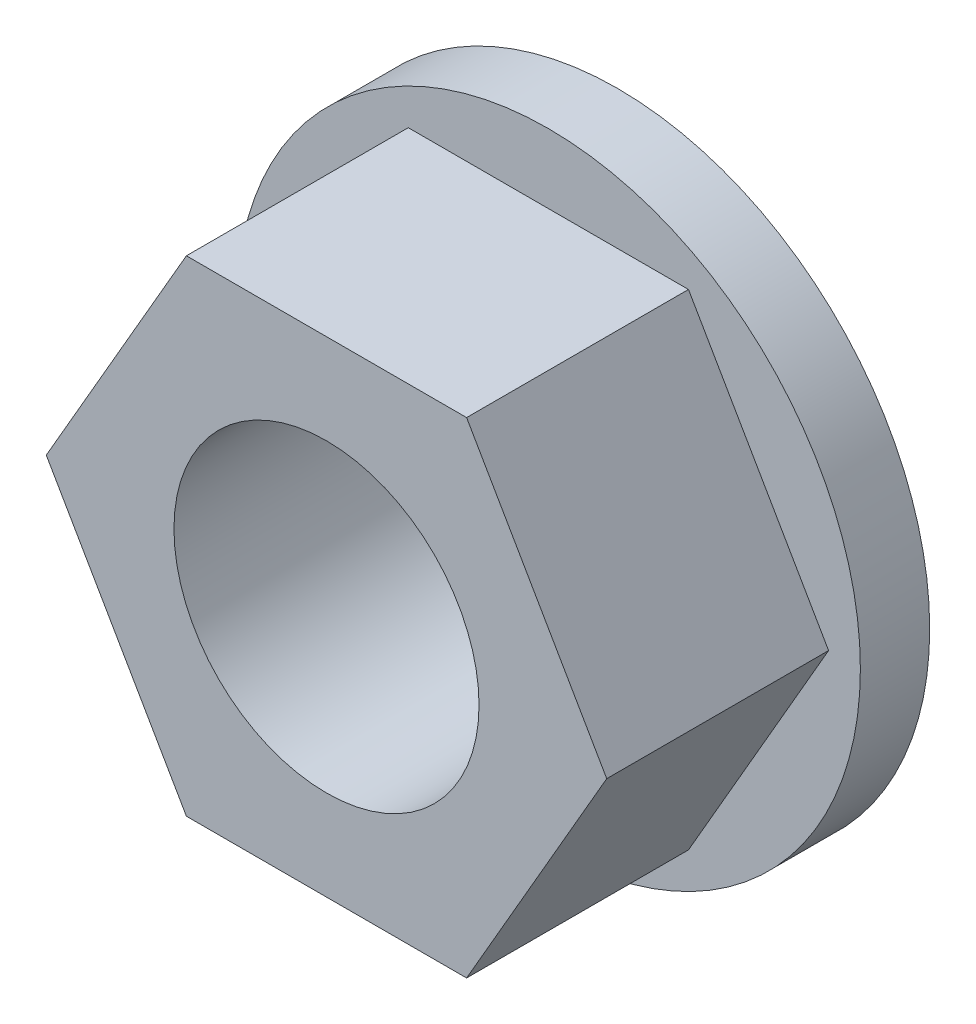
ISO-10303-21;
HEADER;
FILE_DESCRIPTION(('STEP AP214'),'2;1');
FILE_NAME('part.step','',(''),(''),'','','');
FILE_SCHEMA(('AUTOMOTIVE_DESIGN { 1 0 10303 214 1 1 1 1 }'));
ENDSEC;
DATA;
#1=APPLICATION_CONTEXT('core data for automotive mechanical design processes');
#2=APPLICATION_PROTOCOL_DEFINITION('international standard','automotive_design',2000,#1);
#3=PRODUCT_CONTEXT('',#1,'mechanical');
#4=PRODUCT('Part','Part','',(#3));
#5=PRODUCT_RELATED_PRODUCT_CATEGORY('part','',(#4));
#6=PRODUCT_DEFINITION_FORMATION('','',#4);
#7=PRODUCT_DEFINITION_CONTEXT('part definition',#1,'design');
#8=PRODUCT_DEFINITION('design','',#6,#7);
#9=PRODUCT_DEFINITION_SHAPE('','',#8);
#10=(LENGTH_UNIT() NAMED_UNIT(*) SI_UNIT(.MILLI.,.METRE.));
#11=(NAMED_UNIT(*) PLANE_ANGLE_UNIT() SI_UNIT($,.RADIAN.));
#12=(NAMED_UNIT(*) SI_UNIT($,.STERADIAN.) SOLID_ANGLE_UNIT());
#13=UNCERTAINTY_MEASURE_WITH_UNIT(LENGTH_MEASURE(1.E-05),#10,'distance_accuracy_value','');
#14=(GEOMETRIC_REPRESENTATION_CONTEXT(3) GLOBAL_UNCERTAINTY_ASSIGNED_CONTEXT((#13)) GLOBAL_UNIT_ASSIGNED_CONTEXT((#10,
#11,#12)) REPRESENTATION_CONTEXT('',''));
#15=CARTESIAN_POINT('',(0.,0.,0.));
#16=DIRECTION('',(0.,0.,1.));
#17=DIRECTION('',(1.,0.,0.));
#18=AXIS2_PLACEMENT_3D('',#15,#16,#17);
#19=CARTESIAN_POINT('',(0.,0.,4.2));
#20=DIRECTION('',(0.,0.,1.));
#21=DIRECTION('',(1.,0.,0.));
#22=AXIS2_PLACEMENT_3D('',#19,#20,#21);
#23=PLANE('',#22);
#24=CARTESIAN_POINT('',(0.,0.,4.2));
#25=DIRECTION('',(0.,0.,1.));
#26=DIRECTION('',(1.,0.,0.));
#27=AXIS2_PLACEMENT_3D('',#24,#25,#26);
#28=CIRCLE('',#27,2.2);
#29=CARTESIAN_POINT('',(2.2,0.,4.2));
#30=VERTEX_POINT('',#29);
#31=EDGE_CURVE('E9',#30,#30,#28,.T.);
#32=ORIENTED_EDGE('',*,*,#31,.F.);
#33=EDGE_LOOP('',(#32));
#34=FACE_BOUND('',#33,.T.);
#35=DIRECTION('',(-0.50000000000019,0.866025403784329,0.));
#36=VECTOR('',#35,1.);
#37=CARTESIAN_POINT('',(4.041451884327,0.,4.2));
#38=LINE('',#37,#36);
#39=CARTESIAN_POINT('',(4.041451884327,0.,4.2));
#40=VERTEX_POINT('',#39);
#41=CARTESIAN_POINT('',(2.020725942164,3.5,4.2));
#42=VERTEX_POINT('',#41);
#43=EDGE_CURVE('E92',#40,#42,#38,.T.);
#44=ORIENTED_EDGE('',*,*,#43,.T.);
#45=DIRECTION('',(-1.,0.,0.));
#46=VECTOR('',#45,1.);
#47=CARTESIAN_POINT('',(2.020725942164,3.5,4.2));
#48=LINE('',#47,#46);
#49=CARTESIAN_POINT('',(-2.020725942164,3.5,4.2));
#50=VERTEX_POINT('',#49);
#51=EDGE_CURVE('E147',#42,#50,#48,.T.);
#52=ORIENTED_EDGE('',*,*,#51,.T.);
#53=DIRECTION('',(-0.50000000000019,-0.866025403784329,0.));
#54=VECTOR('',#53,1.);
#55=CARTESIAN_POINT('',(-2.020725942164,3.5,4.2));
#56=LINE('',#55,#54);
#57=CARTESIAN_POINT('',(-4.041451884327,0.,4.2));
#58=VERTEX_POINT('',#57);
#59=EDGE_CURVE('E138',#50,#58,#56,.T.);
#60=ORIENTED_EDGE('',*,*,#59,.T.);
#61=DIRECTION('',(0.50000000000019,-0.866025403784329,0.));
#62=VECTOR('',#61,1.);
#63=CARTESIAN_POINT('',(-4.041451884327,0.,4.2));
#64=LINE('',#63,#62);
#65=CARTESIAN_POINT('',(-2.020725942164,-3.5,4.2));
#66=VERTEX_POINT('',#65);
#67=EDGE_CURVE('E137',#58,#66,#64,.T.);
#68=ORIENTED_EDGE('',*,*,#67,.T.);
#69=DIRECTION('',(1.,0.,0.));
#70=VECTOR('',#69,1.);
#71=CARTESIAN_POINT('',(-2.020725942164,-3.5,4.2));
#72=LINE('',#71,#70);
#73=CARTESIAN_POINT('',(2.020725942164,-3.5,4.2));
#74=VERTEX_POINT('',#73);
#75=EDGE_CURVE('E43',#66,#74,#72,.T.);
#76=ORIENTED_EDGE('',*,*,#75,.T.);
#77=DIRECTION('',(0.50000000000019,0.866025403784329,0.));
#78=VECTOR('',#77,1.);
#79=CARTESIAN_POINT('',(2.020725942164,-3.5,4.2));
#80=LINE('',#79,#78);
#81=EDGE_CURVE('E23',#74,#40,#80,.T.);
#82=ORIENTED_EDGE('',*,*,#81,.T.);
#83=EDGE_LOOP('',(#44,#52,#60,#68,#76,#82));
#84=FACE_BOUND('',#83,.T.);
#85=ADVANCED_FACE('F15',(#34,#84),#23,.T.);
#86=CARTESIAN_POINT('',(0.,0.,-1.));
#87=DIRECTION('',(0.,0.,1.));
#88=DIRECTION('',(1.,0.,0.));
#89=AXIS2_PLACEMENT_3D('',#86,#87,#88);
#90=CYLINDRICAL_SURFACE('',#89,2.2);
#91=ORIENTED_EDGE('',*,*,#31,.T.);
#92=EDGE_LOOP('',(#91));
#93=FACE_BOUND('',#92,.T.);
#94=CARTESIAN_POINT('',(0.,0.,0.));
#95=DIRECTION('',(0.,0.,1.));
#96=DIRECTION('',(1.,0.,0.));
#97=AXIS2_PLACEMENT_3D('',#94,#95,#96);
#98=CIRCLE('',#97,2.2);
#99=CARTESIAN_POINT('',(2.2,0.,0.));
#100=VERTEX_POINT('',#99);
#101=EDGE_CURVE('E132',#100,#100,#98,.T.);
#102=ORIENTED_EDGE('',*,*,#101,.F.);
#103=EDGE_LOOP('',(#102));
#104=FACE_BOUND('',#103,.T.);
#105=ADVANCED_FACE('F184',(#93,#104),#90,.F.);
#106=CARTESIAN_POINT('',(2.020725942164,-3.5,1.));
#107=DIRECTION('',(-0.866025403784329,0.50000000000019,0.));
#108=DIRECTION('',(0.,0.,1.));
#109=AXIS2_PLACEMENT_3D('',#106,#107,#108);
#110=PLANE('',#109);
#111=DIRECTION('',(0.50000000000019,0.866025403784329,0.));
#112=VECTOR('',#111,1.);
#113=CARTESIAN_POINT('',(2.020725942164,-3.5,1.));
#114=LINE('',#113,#112);
#115=CARTESIAN_POINT('',(2.020725942164,-3.5,1.));
#116=VERTEX_POINT('',#115);
#117=CARTESIAN_POINT('',(4.041451884327,0.,1.));
#118=VERTEX_POINT('',#117);
#119=EDGE_CURVE('E97',#116,#118,#114,.T.);
#120=ORIENTED_EDGE('',*,*,#119,.T.);
#121=DIRECTION('',(0.,0.,1.));
#122=VECTOR('',#121,1.);
#123=CARTESIAN_POINT('',(4.041451884327,0.,1.));
#124=LINE('',#123,#122);
#125=EDGE_CURVE('E85',#118,#40,#124,.T.);
#126=ORIENTED_EDGE('',*,*,#125,.T.);
#127=ORIENTED_EDGE('',*,*,#81,.F.);
#128=DIRECTION('',(0.,0.,1.));
#129=VECTOR('',#128,1.);
#130=CARTESIAN_POINT('',(2.020725942164,-3.5,1.));
#131=LINE('',#130,#129);
#132=EDGE_CURVE('E99',#116,#74,#131,.T.);
#133=ORIENTED_EDGE('',*,*,#132,.F.);
#134=EDGE_LOOP('',(#120,#126,#127,#133));
#135=FACE_BOUND('',#134,.T.);
#136=ADVANCED_FACE('F98',(#135),#110,.F.);
#137=CARTESIAN_POINT('',(-2.020725942164,-3.5,1.));
#138=DIRECTION('',(0.,1.,0.));
#139=DIRECTION('',(1.,0.,0.));
#140=AXIS2_PLACEMENT_3D('',#137,#138,#139);
#141=PLANE('',#140);
#142=DIRECTION('',(1.,0.,0.));
#143=VECTOR('',#142,1.);
#144=CARTESIAN_POINT('',(-2.020725942164,-3.5,1.));
#145=LINE('',#144,#143);
#146=CARTESIAN_POINT('',(-2.020725942164,-3.5,1.));
#147=VERTEX_POINT('',#146);
#148=EDGE_CURVE('E104',#147,#116,#145,.T.);
#149=ORIENTED_EDGE('',*,*,#148,.T.);
#150=ORIENTED_EDGE('',*,*,#132,.T.);
#151=ORIENTED_EDGE('',*,*,#75,.F.);
#152=DIRECTION('',(0.,0.,1.));
#153=VECTOR('',#152,1.);
#154=CARTESIAN_POINT('',(-2.020725942164,-3.5,1.));
#155=LINE('',#154,#153);
#156=EDGE_CURVE('E133',#147,#66,#155,.T.);
#157=ORIENTED_EDGE('',*,*,#156,.F.);
#158=EDGE_LOOP('',(#149,#150,#151,#157));
#159=FACE_BOUND('',#158,.T.);
#160=ADVANCED_FACE('F164',(#159),#141,.F.);
#161=CARTESIAN_POINT('',(-4.041451884327,0.,1.));
#162=DIRECTION('',(0.866025403784329,0.50000000000019,0.));
#163=DIRECTION('',(0.,0.,-1.));
#164=AXIS2_PLACEMENT_3D('',#161,#162,#163);
#165=PLANE('',#164);
#166=DIRECTION('',(0.50000000000019,-0.866025403784329,0.));
#167=VECTOR('',#166,1.);
#168=CARTESIAN_POINT('',(-4.041451884327,0.,1.));
#169=LINE('',#168,#167);
#170=CARTESIAN_POINT('',(-4.041451884327,0.,1.));
#171=VERTEX_POINT('',#170);
#172=EDGE_CURVE('E127',#171,#147,#169,.T.);
#173=ORIENTED_EDGE('',*,*,#172,.T.);
#174=ORIENTED_EDGE('',*,*,#156,.T.);
#175=ORIENTED_EDGE('',*,*,#67,.F.);
#176=DIRECTION('',(0.,0.,1.));
#177=VECTOR('',#176,1.);
#178=CARTESIAN_POINT('',(-4.041451884327,0.,1.));
#179=LINE('',#178,#177);
#180=EDGE_CURVE('E151',#171,#58,#179,.T.);
#181=ORIENTED_EDGE('',*,*,#180,.F.);
#182=EDGE_LOOP('',(#173,#174,#175,#181));
#183=FACE_BOUND('',#182,.T.);
#184=ADVANCED_FACE('F197',(#183),#165,.F.);
#185=CARTESIAN_POINT('',(-2.020725942164,3.5,1.));
#186=DIRECTION('',(0.866025403784329,-0.50000000000019,0.));
#187=DIRECTION('',(0.,0.,-1.));
#188=AXIS2_PLACEMENT_3D('',#185,#186,#187);
#189=PLANE('',#188);
#190=DIRECTION('',(-0.50000000000019,-0.866025403784329,0.));
#191=VECTOR('',#190,1.);
#192=CARTESIAN_POINT('',(-2.020725942164,3.5,1.));
#193=LINE('',#192,#191);
#194=CARTESIAN_POINT('',(-2.020725942164,3.5,1.));
#195=VERTEX_POINT('',#194);
#196=EDGE_CURVE('E123',#195,#171,#193,.T.);
#197=ORIENTED_EDGE('',*,*,#196,.T.);
#198=ORIENTED_EDGE('',*,*,#180,.T.);
#199=ORIENTED_EDGE('',*,*,#59,.F.);
#200=DIRECTION('',(0.,0.,1.));
#201=VECTOR('',#200,1.);
#202=CARTESIAN_POINT('',(-2.020725942164,3.5,1.));
#203=LINE('',#202,#201);
#204=EDGE_CURVE('E94',#195,#50,#203,.T.);
#205=ORIENTED_EDGE('',*,*,#204,.F.);
#206=EDGE_LOOP('',(#197,#198,#199,#205));
#207=FACE_BOUND('',#206,.T.);
#208=ADVANCED_FACE('F200',(#207),#189,.F.);
#209=CARTESIAN_POINT('',(2.020725942164,3.5,1.));
#210=DIRECTION('',(0.,-1.,0.));
#211=DIRECTION('',(-1.,0.,0.));
#212=AXIS2_PLACEMENT_3D('',#209,#210,#211);
#213=PLANE('',#212);
#214=DIRECTION('',(-1.,0.,0.));
#215=VECTOR('',#214,1.);
#216=CARTESIAN_POINT('',(2.020725942164,3.5,1.));
#217=LINE('',#216,#215);
#218=CARTESIAN_POINT('',(2.020725942164,3.5,1.));
#219=VERTEX_POINT('',#218);
#220=EDGE_CURVE('E111',#219,#195,#217,.T.);
#221=ORIENTED_EDGE('',*,*,#220,.T.);
#222=ORIENTED_EDGE('',*,*,#204,.T.);
#223=ORIENTED_EDGE('',*,*,#51,.F.);
#224=DIRECTION('',(0.,0.,1.));
#225=VECTOR('',#224,1.);
#226=CARTESIAN_POINT('',(2.020725942164,3.5,1.));
#227=LINE('',#226,#225);
#228=EDGE_CURVE('E141',#219,#42,#227,.T.);
#229=ORIENTED_EDGE('',*,*,#228,.F.);
#230=EDGE_LOOP('',(#221,#222,#223,#229));
#231=FACE_BOUND('',#230,.T.);
#232=ADVANCED_FACE('F203',(#231),#213,.F.);
#233=CARTESIAN_POINT('',(4.041451884327,0.,1.));
#234=DIRECTION('',(-0.866025403784329,-0.50000000000019,0.));
#235=DIRECTION('',(-0.50000000000019,0.866025403784329,0.));
#236=AXIS2_PLACEMENT_3D('',#233,#234,#235);
#237=PLANE('',#236);
#238=DIRECTION('',(-0.50000000000019,0.866025403784329,0.));
#239=VECTOR('',#238,1.);
#240=CARTESIAN_POINT('',(4.041451884327,0.,1.));
#241=LINE('',#240,#239);
#242=EDGE_CURVE('E90',#118,#219,#241,.T.);
#243=ORIENTED_EDGE('',*,*,#242,.T.);
#244=ORIENTED_EDGE('',*,*,#228,.T.);
#245=ORIENTED_EDGE('',*,*,#43,.F.);
#246=ORIENTED_EDGE('',*,*,#125,.F.);
#247=EDGE_LOOP('',(#243,#244,#245,#246));
#248=FACE_BOUND('',#247,.T.);
#249=ADVANCED_FACE('F87',(#248),#237,.F.);
#250=CARTESIAN_POINT('',(0.,0.,0.));
#251=DIRECTION('',(0.,0.,1.));
#252=DIRECTION('',(1.,0.,0.));
#253=AXIS2_PLACEMENT_3D('',#250,#251,#252);
#254=PLANE('',#253);
#255=ORIENTED_EDGE('',*,*,#101,.T.);
#256=EDGE_LOOP('',(#255));
#257=FACE_BOUND('',#256,.T.);
#258=CARTESIAN_POINT('',(0.,0.,0.));
#259=DIRECTION('',(0.,0.,1.));
#260=DIRECTION('',(1.,0.,0.));
#261=AXIS2_PLACEMENT_3D('',#258,#259,#260);
#262=CIRCLE('',#261,4.5);
#263=CARTESIAN_POINT('',(4.5,0.,0.));
#264=VERTEX_POINT('',#263);
#265=EDGE_CURVE('E113',#264,#264,#262,.T.);
#266=ORIENTED_EDGE('',*,*,#265,.F.);
#267=EDGE_LOOP('',(#266));
#268=FACE_BOUND('',#267,.T.);
#269=ADVANCED_FACE('F181',(#257,#268),#254,.F.);
#270=CARTESIAN_POINT('',(0.,0.,1.));
#271=DIRECTION('',(0.,0.,1.));
#272=DIRECTION('',(1.,0.,0.));
#273=AXIS2_PLACEMENT_3D('',#270,#271,#272);
#274=PLANE('',#273);
#275=ORIENTED_EDGE('',*,*,#242,.F.);
#276=ORIENTED_EDGE('',*,*,#119,.F.);
#277=ORIENTED_EDGE('',*,*,#148,.F.);
#278=ORIENTED_EDGE('',*,*,#172,.F.);
#279=ORIENTED_EDGE('',*,*,#196,.F.);
#280=ORIENTED_EDGE('',*,*,#220,.F.);
#281=EDGE_LOOP('',(#275,#276,#277,#278,#279,#280));
#282=FACE_BOUND('',#281,.T.);
#283=CARTESIAN_POINT('',(0.,0.,1.));
#284=DIRECTION('',(0.,0.,1.));
#285=DIRECTION('',(1.,0.,0.));
#286=AXIS2_PLACEMENT_3D('',#283,#284,#285);
#287=CIRCLE('',#286,4.5);
#288=CARTESIAN_POINT('',(4.5,0.,1.));
#289=VERTEX_POINT('',#288);
#290=EDGE_CURVE('E119',#289,#289,#287,.T.);
#291=ORIENTED_EDGE('',*,*,#290,.T.);
#292=EDGE_LOOP('',(#291));
#293=FACE_BOUND('',#292,.T.);
#294=ADVANCED_FACE('F107',(#282,#293),#274,.T.);
#295=CARTESIAN_POINT('',(0.,0.,0.));
#296=DIRECTION('',(0.,0.,1.));
#297=DIRECTION('',(1.,0.,0.));
#298=AXIS2_PLACEMENT_3D('',#295,#296,#297);
#299=CYLINDRICAL_SURFACE('',#298,4.5);
#300=ORIENTED_EDGE('',*,*,#290,.F.);
#301=EDGE_LOOP('',(#300));
#302=FACE_BOUND('',#301,.T.);
#303=ORIENTED_EDGE('',*,*,#265,.T.);
#304=EDGE_LOOP('',(#303));
#305=FACE_BOUND('',#304,.T.);
#306=ADVANCED_FACE('F214',(#302,#305),#299,.T.);
#307=CLOSED_SHELL('',(#85,#105,#136,#160,#184,#208,#232,#249,#269,#294,#306));
#308=MANIFOLD_SOLID_BREP('B1',#307);
#309=ADVANCED_BREP_SHAPE_REPRESENTATION('',(#18,#308),#14);
#310=SHAPE_DEFINITION_REPRESENTATION(#9,#309);
ENDSEC;
END-ISO-10303-21;
